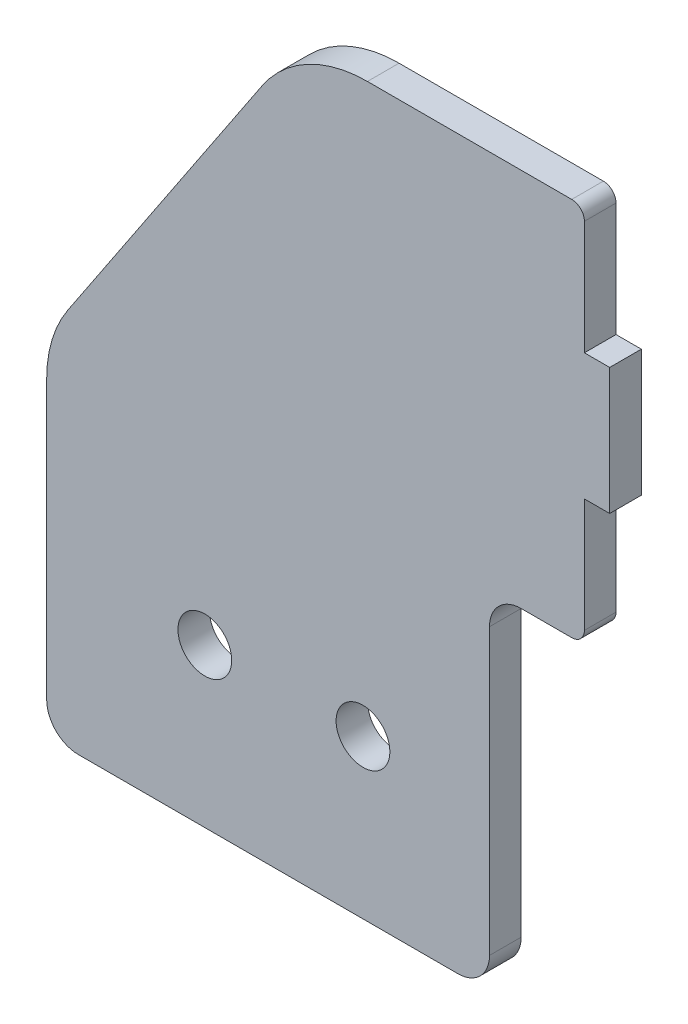
ISO-10303-21;
HEADER;
FILE_DESCRIPTION(('STEP AP214'),'2;1');
FILE_NAME('part.step','',(''),(''),'','','');
FILE_SCHEMA(('AUTOMOTIVE_DESIGN { 1 0 10303 214 1 1 1 1 }'));
ENDSEC;
DATA;
#1=APPLICATION_CONTEXT('core data for automotive mechanical design processes');
#2=APPLICATION_PROTOCOL_DEFINITION('international standard','automotive_design',2000,#1);
#3=PRODUCT_CONTEXT('',#1,'mechanical');
#4=PRODUCT('Part','Part','',(#3));
#5=PRODUCT_RELATED_PRODUCT_CATEGORY('part','',(#4));
#6=PRODUCT_DEFINITION_FORMATION('','',#4);
#7=PRODUCT_DEFINITION_CONTEXT('part definition',#1,'design');
#8=PRODUCT_DEFINITION('design','',#6,#7);
#9=PRODUCT_DEFINITION_SHAPE('','',#8);
#10=(LENGTH_UNIT() NAMED_UNIT(*) SI_UNIT(.MILLI.,.METRE.));
#11=(NAMED_UNIT(*) PLANE_ANGLE_UNIT() SI_UNIT($,.RADIAN.));
#12=(NAMED_UNIT(*) SI_UNIT($,.STERADIAN.) SOLID_ANGLE_UNIT());
#13=UNCERTAINTY_MEASURE_WITH_UNIT(LENGTH_MEASURE(1.E-05),#10,'distance_accuracy_value','');
#14=(GEOMETRIC_REPRESENTATION_CONTEXT(3) GLOBAL_UNCERTAINTY_ASSIGNED_CONTEXT((#13)) GLOBAL_UNIT_ASSIGNED_CONTEXT((#10,
#11,#12)) REPRESENTATION_CONTEXT('',''));
#15=CARTESIAN_POINT('',(0.,0.,0.));
#16=DIRECTION('',(0.,0.,1.));
#17=DIRECTION('',(1.,0.,0.));
#18=AXIS2_PLACEMENT_3D('',#15,#16,#17);
#19=CARTESIAN_POINT('',(0.,0.,-5.));
#20=DIRECTION('',(1.,0.,0.));
#21=DIRECTION('',(0.,1.,0.));
#22=AXIS2_PLACEMENT_3D('',#19,#20,#21);
#23=PLANE('',#22);
#24=DIRECTION('',(0.,1.,0.));
#25=VECTOR('',#24,1.);
#26=CARTESIAN_POINT('',(0.,0.,-5.));
#27=LINE('',#26,#25);
#28=CARTESIAN_POINT('',(0.,-58.,-5.));
#29=VERTEX_POINT('',#28);
#30=CARTESIAN_POINT('',(0.,-40.,-5.));
#31=VERTEX_POINT('',#30);
#32=EDGE_CURVE('E204',#29,#31,#27,.T.);
#33=ORIENTED_EDGE('',*,*,#32,.T.);
#34=DIRECTION('',(0.,0.,-1.));
#35=VECTOR('',#34,1.);
#36=CARTESIAN_POINT('',(0.,-40.,0.));
#37=LINE('',#36,#35);
#38=CARTESIAN_POINT('',(0.,-40.,0.));
#39=VERTEX_POINT('',#38);
#40=EDGE_CURVE('E317',#39,#31,#37,.T.);
#41=ORIENTED_EDGE('',*,*,#40,.F.);
#42=DIRECTION('',(0.,1.,0.));
#43=VECTOR('',#42,1.);
#44=CARTESIAN_POINT('',(0.,0.,0.));
#45=LINE('',#44,#43);
#46=CARTESIAN_POINT('',(0.,-58.,0.));
#47=VERTEX_POINT('',#46);
#48=EDGE_CURVE('E185',#47,#39,#45,.T.);
#49=ORIENTED_EDGE('',*,*,#48,.F.);
#50=DIRECTION('',(0.,0.,1.));
#51=VECTOR('',#50,1.);
#52=CARTESIAN_POINT('',(0.,-58.,-5.));
#53=LINE('',#52,#51);
#54=EDGE_CURVE('E298',#47,#29,#53,.F.);
#55=ORIENTED_EDGE('',*,*,#54,.T.);
#56=EDGE_LOOP('',(#33,#41,#49,#55));
#57=FACE_BOUND('',#56,.T.);
#58=ADVANCED_FACE('F39',(#57),#23,.T.);
#59=CARTESIAN_POINT('',(0.,-20.,0.));
#60=VERTEX_POINT('',#59);
#61=CARTESIAN_POINT('',(0.,-2.,0.));
#62=VERTEX_POINT('',#61);
#63=EDGE_CURVE('E203',#60,#62,#45,.T.);
#64=ORIENTED_EDGE('',*,*,#63,.F.);
#65=DIRECTION('',(0.,0.,1.));
#66=VECTOR('',#65,1.);
#67=CARTESIAN_POINT('',(0.,-20.,0.));
#68=LINE('',#67,#66);
#69=CARTESIAN_POINT('',(0.,-20.,-5.));
#70=VERTEX_POINT('',#69);
#71=EDGE_CURVE('E179',#70,#60,#68,.T.);
#72=ORIENTED_EDGE('',*,*,#71,.F.);
#73=CARTESIAN_POINT('',(0.,-2.,-5.));
#74=VERTEX_POINT('',#73);
#75=EDGE_CURVE('E208',#70,#74,#27,.T.);
#76=ORIENTED_EDGE('',*,*,#75,.T.);
#77=DIRECTION('',(0.,0.,1.));
#78=VECTOR('',#77,1.);
#79=CARTESIAN_POINT('',(0.,-2.,-5.));
#80=LINE('',#79,#78);
#81=EDGE_CURVE('E295',#74,#62,#80,.T.);
#82=ORIENTED_EDGE('',*,*,#81,.T.);
#83=EDGE_LOOP('',(#64,#72,#76,#82));
#84=FACE_BOUND('',#83,.T.);
#85=ADVANCED_FACE('F330',(#84),#23,.T.);
#86=CARTESIAN_POINT('',(0.,-60.,-5.));
#87=DIRECTION('',(0.,-1.,0.));
#88=DIRECTION('',(1.,0.,0.));
#89=AXIS2_PLACEMENT_3D('',#86,#87,#88);
#90=PLANE('',#89);
#91=DIRECTION('',(1.,0.,0.));
#92=VECTOR('',#91,1.);
#93=CARTESIAN_POINT('',(0.,-60.,-5.));
#94=LINE('',#93,#92);
#95=CARTESIAN_POINT('',(-10.,-60.,-5.));
#96=VERTEX_POINT('',#95);
#97=CARTESIAN_POINT('',(-1.99999999999999,-60.,-5.));
#98=VERTEX_POINT('',#97);
#99=EDGE_CURVE('E222',#96,#98,#94,.T.);
#100=ORIENTED_EDGE('',*,*,#99,.T.);
#101=DIRECTION('',(0.,0.,1.));
#102=VECTOR('',#101,1.);
#103=CARTESIAN_POINT('',(-1.99999999999999,-60.,-5.));
#104=LINE('',#103,#102);
#105=CARTESIAN_POINT('',(-1.99999999999999,-60.,0.));
#106=VERTEX_POINT('',#105);
#107=EDGE_CURVE('E288',#98,#106,#104,.T.);
#108=ORIENTED_EDGE('',*,*,#107,.T.);
#109=DIRECTION('',(1.,0.,0.));
#110=VECTOR('',#109,1.);
#111=CARTESIAN_POINT('',(0.,-60.,0.));
#112=LINE('',#111,#110);
#113=CARTESIAN_POINT('',(-10.,-60.,0.));
#114=VERTEX_POINT('',#113);
#115=EDGE_CURVE('E241',#114,#106,#112,.T.);
#116=ORIENTED_EDGE('',*,*,#115,.F.);
#117=DIRECTION('',(0.,0.,1.));
#118=VECTOR('',#117,1.);
#119=CARTESIAN_POINT('',(-10.,-60.,-5.));
#120=LINE('',#119,#118);
#121=EDGE_CURVE('E282',#114,#96,#120,.F.);
#122=ORIENTED_EDGE('',*,*,#121,.T.);
#123=EDGE_LOOP('',(#100,#108,#116,#122));
#124=FACE_BOUND('',#123,.T.);
#125=ADVANCED_FACE('F312',(#124),#90,.T.);
#126=CARTESIAN_POINT('',(-15.,-60.,-5.));
#127=DIRECTION('',(1.,0.,0.));
#128=DIRECTION('',(0.,1.,0.));
#129=AXIS2_PLACEMENT_3D('',#126,#127,#128);
#130=PLANE('',#129);
#131=DIRECTION('',(0.,1.,0.));
#132=VECTOR('',#131,1.);
#133=CARTESIAN_POINT('',(-15.,-60.,0.));
#134=LINE('',#133,#132);
#135=CARTESIAN_POINT('',(-15.,-110.,0.));
#136=VERTEX_POINT('',#135);
#137=CARTESIAN_POINT('',(-15.,-65.,0.));
#138=VERTEX_POINT('',#137);
#139=EDGE_CURVE('E238',#136,#138,#134,.T.);
#140=ORIENTED_EDGE('',*,*,#139,.F.);
#141=DIRECTION('',(0.,0.,1.));
#142=VECTOR('',#141,1.);
#143=CARTESIAN_POINT('',(-15.,-110.,-5.));
#144=LINE('',#143,#142);
#145=CARTESIAN_POINT('',(-15.,-110.,-5.));
#146=VERTEX_POINT('',#145);
#147=EDGE_CURVE('E280',#136,#146,#144,.F.);
#148=ORIENTED_EDGE('',*,*,#147,.T.);
#149=DIRECTION('',(0.,1.,0.));
#150=VECTOR('',#149,1.);
#151=CARTESIAN_POINT('',(-15.,-60.,-5.));
#152=LINE('',#151,#150);
#153=CARTESIAN_POINT('',(-15.,-65.,-5.));
#154=VERTEX_POINT('',#153);
#155=EDGE_CURVE('E219',#146,#154,#152,.T.);
#156=ORIENTED_EDGE('',*,*,#155,.T.);
#157=DIRECTION('',(0.,0.,1.));
#158=VECTOR('',#157,1.);
#159=CARTESIAN_POINT('',(-15.,-65.,0.));
#160=LINE('',#159,#158);
#161=EDGE_CURVE('E277',#154,#138,#160,.T.);
#162=ORIENTED_EDGE('',*,*,#161,.T.);
#163=EDGE_LOOP('',(#140,#148,#156,#162));
#164=FACE_BOUND('',#163,.T.);
#165=ADVANCED_FACE('F371',(#164),#130,.T.);
#166=CARTESIAN_POINT('',(-15.,-115.,-5.));
#167=DIRECTION('',(0.,-1.,0.));
#168=DIRECTION('',(0.,0.,-1.));
#169=AXIS2_PLACEMENT_3D('',#166,#167,#168);
#170=PLANE('',#169);
#171=DIRECTION('',(1.,0.,0.));
#172=VECTOR('',#171,1.);
#173=CARTESIAN_POINT('',(-15.,-115.,0.));
#174=LINE('',#173,#172);
#175=CARTESIAN_POINT('',(-80.,-115.,0.));
#176=VERTEX_POINT('',#175);
#177=CARTESIAN_POINT('',(-20.,-115.,0.));
#178=VERTEX_POINT('',#177);
#179=EDGE_CURVE('E235',#176,#178,#174,.T.);
#180=ORIENTED_EDGE('',*,*,#179,.F.);
#181=DIRECTION('',(0.,0.,1.));
#182=VECTOR('',#181,1.);
#183=CARTESIAN_POINT('',(-80.,-115.,-5.));
#184=LINE('',#183,#182);
#185=CARTESIAN_POINT('',(-80.,-115.,-5.));
#186=VERTEX_POINT('',#185);
#187=EDGE_CURVE('E271',#176,#186,#184,.F.);
#188=ORIENTED_EDGE('',*,*,#187,.T.);
#189=DIRECTION('',(1.,0.,0.));
#190=VECTOR('',#189,1.);
#191=CARTESIAN_POINT('',(-15.,-115.,-5.));
#192=LINE('',#191,#190);
#193=CARTESIAN_POINT('',(-20.,-115.,-5.));
#194=VERTEX_POINT('',#193);
#195=EDGE_CURVE('E216',#186,#194,#192,.T.);
#196=ORIENTED_EDGE('',*,*,#195,.T.);
#197=DIRECTION('',(0.,0.,1.));
#198=VECTOR('',#197,1.);
#199=CARTESIAN_POINT('',(-20.,-115.,-5.));
#200=LINE('',#199,#198);
#201=EDGE_CURVE('E268',#194,#178,#200,.T.);
#202=ORIENTED_EDGE('',*,*,#201,.T.);
#203=EDGE_LOOP('',(#180,#188,#196,#202));
#204=FACE_BOUND('',#203,.T.);
#205=ADVANCED_FACE('F362',(#204),#170,.T.);
#206=CARTESIAN_POINT('',(-85.,-115.,-5.));
#207=DIRECTION('',(-1.,0.,0.));
#208=DIRECTION('',(0.,0.,1.));
#209=AXIS2_PLACEMENT_3D('',#206,#207,#208);
#210=PLANE('',#209);
#211=DIRECTION('',(0.,-1.,0.));
#212=VECTOR('',#211,1.);
#213=CARTESIAN_POINT('',(-85.,-115.,-5.));
#214=LINE('',#213,#212);
#215=CARTESIAN_POINT('',(-85.,-66.0555127546399,-5.));
#216=VERTEX_POINT('',#215);
#217=CARTESIAN_POINT('',(-85.,-110.,-5.));
#218=VERTEX_POINT('',#217);
#219=EDGE_CURVE('E213',#216,#218,#214,.T.);
#220=ORIENTED_EDGE('',*,*,#219,.T.);
#221=DIRECTION('',(0.,0.,1.));
#222=VECTOR('',#221,1.);
#223=CARTESIAN_POINT('',(-85.,-110.,-5.));
#224=LINE('',#223,#222);
#225=CARTESIAN_POINT('',(-85.,-110.,0.));
#226=VERTEX_POINT('',#225);
#227=EDGE_CURVE('E261',#218,#226,#224,.T.);
#228=ORIENTED_EDGE('',*,*,#227,.T.);
#229=DIRECTION('',(0.,-1.,0.));
#230=VECTOR('',#229,1.);
#231=CARTESIAN_POINT('',(-85.,-115.,0.));
#232=LINE('',#231,#230);
#233=CARTESIAN_POINT('',(-85.,-66.0555127546399,0.));
#234=VERTEX_POINT('',#233);
#235=EDGE_CURVE('E232',#234,#226,#232,.T.);
#236=ORIENTED_EDGE('',*,*,#235,.F.);
#237=DIRECTION('',(0.,0.,1.));
#238=VECTOR('',#237,1.);
#239=CARTESIAN_POINT('',(-85.,-66.0555127546399,-5.));
#240=LINE('',#239,#238);
#241=EDGE_CURVE('E251',#234,#216,#240,.F.);
#242=ORIENTED_EDGE('',*,*,#241,.T.);
#243=EDGE_LOOP('',(#220,#228,#236,#242));
#244=FACE_BOUND('',#243,.T.);
#245=ADVANCED_FACE('F353',(#244),#210,.T.);
#246=CARTESIAN_POINT('',(-85.,-60.,-5.));
#247=DIRECTION('',(-0.832050294337844,0.554700196225229,0.));
#248=DIRECTION('',(-0.554700196225229,-0.832050294337844,0.));
#249=AXIS2_PLACEMENT_3D('',#246,#247,#248);
#250=PLANE('',#249);
#251=DIRECTION('',(-0.554700196225229,-0.832050294337844,0.));
#252=VECTOR('',#251,1.);
#253=CARTESIAN_POINT('',(-85.,-60.,-5.));
#254=LINE('',#253,#252);
#255=CARTESIAN_POINT('',(-50.9373307169969,-8.90599607549541,-5.));
#256=VERTEX_POINT('',#255);
#257=CARTESIAN_POINT('',(-81.6410058867569,-54.9615088301353,-5.));
#258=VERTEX_POINT('',#257);
#259=EDGE_CURVE('E210',#256,#258,#254,.T.);
#260=ORIENTED_EDGE('',*,*,#259,.T.);
#261=DIRECTION('',(0.,0.,1.));
#262=VECTOR('',#261,1.);
#263=CARTESIAN_POINT('',(-81.6410058867569,-54.9615088301353,-5.));
#264=LINE('',#263,#262);
#265=CARTESIAN_POINT('',(-81.6410058867569,-54.9615088301353,0.));
#266=VERTEX_POINT('',#265);
#267=EDGE_CURVE('E244',#258,#266,#264,.T.);
#268=ORIENTED_EDGE('',*,*,#267,.T.);
#269=DIRECTION('',(-0.554700196225229,-0.832050294337844,0.));
#270=VECTOR('',#269,1.);
#271=CARTESIAN_POINT('',(-85.,-60.,0.));
#272=LINE('',#271,#270);
#273=CARTESIAN_POINT('',(-50.9373307169969,-8.90599607549541,0.));
#274=VERTEX_POINT('',#273);
#275=EDGE_CURVE('E229',#274,#266,#272,.T.);
#276=ORIENTED_EDGE('',*,*,#275,.F.);
#277=DIRECTION('',(0.,0.,1.));
#278=VECTOR('',#277,1.);
#279=CARTESIAN_POINT('',(-50.9373307169969,-8.90599607549542,-5.));
#280=LINE('',#279,#278);
#281=EDGE_CURVE('E225',#274,#256,#280,.F.);
#282=ORIENTED_EDGE('',*,*,#281,.T.);
#283=EDGE_LOOP('',(#260,#268,#276,#282));
#284=FACE_BOUND('',#283,.T.);
#285=ADVANCED_FACE('F344',(#284),#250,.T.);
#286=CARTESIAN_POINT('',(0.,0.,-5.));
#287=DIRECTION('',(0.,1.,0.));
#288=DIRECTION('',(-1.,0.,0.));
#289=AXIS2_PLACEMENT_3D('',#286,#287,#288);
#290=PLANE('',#289);
#291=DIRECTION('',(-1.,0.,0.));
#292=VECTOR('',#291,1.);
#293=CARTESIAN_POINT('',(0.,0.,0.));
#294=LINE('',#293,#292);
#295=CARTESIAN_POINT('',(-2.,0.,0.));
#296=VERTEX_POINT('',#295);
#297=CARTESIAN_POINT('',(-34.2963248302401,0.,0.));
#298=VERTEX_POINT('',#297);
#299=EDGE_CURVE('E227',#296,#298,#294,.T.);
#300=ORIENTED_EDGE('',*,*,#299,.F.);
#301=DIRECTION('',(0.,0.,1.));
#302=VECTOR('',#301,1.);
#303=CARTESIAN_POINT('',(-2.,0.,-5.));
#304=LINE('',#303,#302);
#305=CARTESIAN_POINT('',(-2.,0.,-5.));
#306=VERTEX_POINT('',#305);
#307=EDGE_CURVE('E11',#296,#306,#304,.F.);
#308=ORIENTED_EDGE('',*,*,#307,.T.);
#309=DIRECTION('',(-1.,0.,0.));
#310=VECTOR('',#309,1.);
#311=CARTESIAN_POINT('',(0.,0.,-5.));
#312=LINE('',#311,#310);
#313=CARTESIAN_POINT('',(-34.2963248302401,0.,-5.));
#314=VERTEX_POINT('',#313);
#315=EDGE_CURVE('E207',#306,#314,#312,.T.);
#316=ORIENTED_EDGE('',*,*,#315,.T.);
#317=DIRECTION('',(0.,0.,1.));
#318=VECTOR('',#317,1.);
#319=CARTESIAN_POINT('',(-34.2963248302401,0.,-5.));
#320=LINE('',#319,#318);
#321=EDGE_CURVE('E258',#314,#298,#320,.T.);
#322=ORIENTED_EDGE('',*,*,#321,.T.);
#323=EDGE_LOOP('',(#300,#308,#316,#322));
#324=FACE_BOUND('',#323,.T.);
#325=ADVANCED_FACE('F336',(#324),#290,.T.);
#326=CARTESIAN_POINT('',(0.,0.,-5.));
#327=DIRECTION('',(0.,0.,-1.));
#328=DIRECTION('',(-1.,0.,0.));
#329=AXIS2_PLACEMENT_3D('',#326,#327,#328);
#330=PLANE('',#329);
#331=CARTESIAN_POINT('',(-35.,-90.,-5.));
#332=DIRECTION('',(0.,0.,-1.));
#333=DIRECTION('',(-1.,0.,0.));
#334=AXIS2_PLACEMENT_3D('',#331,#332,#333);
#335=CIRCLE('',#334,4.25000000000001);
#336=CARTESIAN_POINT('',(-39.25,-90.,-5.));
#337=VERTEX_POINT('',#336);
#338=EDGE_CURVE('E200',#337,#337,#335,.T.);
#339=ORIENTED_EDGE('',*,*,#338,.F.);
#340=EDGE_LOOP('',(#339));
#341=FACE_BOUND('',#340,.T.);
#342=CARTESIAN_POINT('',(-60.,-90.,-5.));
#343=DIRECTION('',(0.,0.,-1.));
#344=DIRECTION('',(-1.,0.,0.));
#345=AXIS2_PLACEMENT_3D('',#342,#343,#344);
#346=CIRCLE('',#345,4.25000000000001);
#347=CARTESIAN_POINT('',(-64.25,-90.,-5.));
#348=VERTEX_POINT('',#347);
#349=EDGE_CURVE('E196',#348,#348,#346,.T.);
#350=ORIENTED_EDGE('',*,*,#349,.F.);
#351=EDGE_LOOP('',(#350));
#352=FACE_BOUND('',#351,.T.);
#353=ORIENTED_EDGE('',*,*,#32,.F.);
#354=CARTESIAN_POINT('',(-1.99999999999999,-58.,-5.));
#355=DIRECTION('',(0.,0.,-1.));
#356=DIRECTION('',(-1.,0.,0.));
#357=AXIS2_PLACEMENT_3D('',#354,#355,#356);
#358=CIRCLE('',#357,2.);
#359=EDGE_CURVE('E47',#29,#98,#358,.T.);
#360=ORIENTED_EDGE('',*,*,#359,.T.);
#361=ORIENTED_EDGE('',*,*,#99,.F.);
#362=CARTESIAN_POINT('',(-9.99999999999999,-65.,-5.));
#363=DIRECTION('',(0.,0.,-1.));
#364=DIRECTION('',(-1.,0.,0.));
#365=AXIS2_PLACEMENT_3D('',#362,#363,#364);
#366=CIRCLE('',#365,5.);
#367=EDGE_CURVE('E286',#96,#154,#366,.F.);
#368=ORIENTED_EDGE('',*,*,#367,.T.);
#369=ORIENTED_EDGE('',*,*,#155,.F.);
#370=CARTESIAN_POINT('',(-20.,-110.,-5.));
#371=DIRECTION('',(0.,0.,-1.));
#372=DIRECTION('',(-1.,0.,0.));
#373=AXIS2_PLACEMENT_3D('',#370,#371,#372);
#374=CIRCLE('',#373,5.);
#375=EDGE_CURVE('E273',#146,#194,#374,.T.);
#376=ORIENTED_EDGE('',*,*,#375,.T.);
#377=ORIENTED_EDGE('',*,*,#195,.F.);
#378=CARTESIAN_POINT('',(-80.,-110.,-5.));
#379=DIRECTION('',(0.,0.,-1.));
#380=DIRECTION('',(-1.,0.,0.));
#381=AXIS2_PLACEMENT_3D('',#378,#379,#380);
#382=CIRCLE('',#381,5.);
#383=EDGE_CURVE('E275',#186,#218,#382,.T.);
#384=ORIENTED_EDGE('',*,*,#383,.T.);
#385=ORIENTED_EDGE('',*,*,#219,.F.);
#386=CARTESIAN_POINT('',(-65.,-66.0555127546399,-5.));
#387=DIRECTION('',(0.,0.,-1.));
#388=DIRECTION('',(-1.,0.,0.));
#389=AXIS2_PLACEMENT_3D('',#386,#387,#388);
#390=CIRCLE('',#389,20.);
#391=EDGE_CURVE('E256',#216,#258,#390,.T.);
#392=ORIENTED_EDGE('',*,*,#391,.T.);
#393=ORIENTED_EDGE('',*,*,#259,.F.);
#394=CARTESIAN_POINT('',(-34.2963248302401,-20.,-5.));
#395=DIRECTION('',(0.,0.,-1.));
#396=DIRECTION('',(-1.,0.,0.));
#397=AXIS2_PLACEMENT_3D('',#394,#395,#396);
#398=CIRCLE('',#397,20.);
#399=EDGE_CURVE('E253',#256,#314,#398,.T.);
#400=ORIENTED_EDGE('',*,*,#399,.T.);
#401=ORIENTED_EDGE('',*,*,#315,.F.);
#402=CARTESIAN_POINT('',(-2.,-2.,-5.));
#403=DIRECTION('',(0.,0.,-1.));
#404=DIRECTION('',(-1.,0.,0.));
#405=AXIS2_PLACEMENT_3D('',#402,#403,#404);
#406=CIRCLE('',#405,2.);
#407=EDGE_CURVE('E300',#306,#74,#406,.T.);
#408=ORIENTED_EDGE('',*,*,#407,.T.);
#409=ORIENTED_EDGE('',*,*,#75,.F.);
#410=DIRECTION('',(-1.,0.,0.));
#411=VECTOR('',#410,1.);
#412=CARTESIAN_POINT('',(4.,-20.,-5.));
#413=LINE('',#412,#411);
#414=CARTESIAN_POINT('',(4.,-20.,-5.));
#415=VERTEX_POINT('',#414);
#416=EDGE_CURVE('E191',#415,#70,#413,.T.);
#417=ORIENTED_EDGE('',*,*,#416,.F.);
#418=DIRECTION('',(0.,1.,0.));
#419=VECTOR('',#418,1.);
#420=CARTESIAN_POINT('',(4.,-20.,-5.));
#421=LINE('',#420,#419);
#422=CARTESIAN_POINT('',(4.00000000000001,-40.,-5.));
#423=VERTEX_POINT('',#422);
#424=EDGE_CURVE('E173',#423,#415,#421,.T.);
#425=ORIENTED_EDGE('',*,*,#424,.F.);
#426=DIRECTION('',(-1.,0.,0.));
#427=VECTOR('',#426,1.);
#428=CARTESIAN_POINT('',(4.00000000000001,-40.,-5.));
#429=LINE('',#428,#427);
#430=EDGE_CURVE('E170',#423,#31,#429,.T.);
#431=ORIENTED_EDGE('',*,*,#430,.T.);
#432=EDGE_LOOP('',(#353,#360,#361,#368,#369,#376,#377,#384,#385,#392,#393,#400,#401,#408,#409,
#417,#425,#431));
#433=FACE_BOUND('',#432,.T.);
#434=ADVANCED_FACE('F306',(#341,#352,#433),#330,.T.);
#435=CARTESIAN_POINT('',(0.,0.,0.));
#436=DIRECTION('',(0.,0.,-1.));
#437=DIRECTION('',(-1.,0.,0.));
#438=AXIS2_PLACEMENT_3D('',#435,#436,#437);
#439=PLANE('',#438);
#440=CARTESIAN_POINT('',(-35.,-90.,0.));
#441=DIRECTION('',(0.,0.,1.));
#442=DIRECTION('',(1.,0.,0.));
#443=AXIS2_PLACEMENT_3D('',#440,#441,#442);
#444=CIRCLE('',#443,4.25000000000001);
#445=CARTESIAN_POINT('',(-30.75,-90.,0.));
#446=VERTEX_POINT('',#445);
#447=EDGE_CURVE('E189',#446,#446,#444,.T.);
#448=ORIENTED_EDGE('',*,*,#447,.F.);
#449=EDGE_LOOP('',(#448));
#450=FACE_BOUND('',#449,.T.);
#451=CARTESIAN_POINT('',(-60.,-90.,0.));
#452=DIRECTION('',(0.,0.,1.));
#453=DIRECTION('',(1.,0.,0.));
#454=AXIS2_PLACEMENT_3D('',#451,#452,#453);
#455=CIRCLE('',#454,4.25000000000001);
#456=CARTESIAN_POINT('',(-55.75,-90.,0.));
#457=VERTEX_POINT('',#456);
#458=EDGE_CURVE('E186',#457,#457,#455,.T.);
#459=ORIENTED_EDGE('',*,*,#458,.F.);
#460=EDGE_LOOP('',(#459));
#461=FACE_BOUND('',#460,.T.);
#462=ORIENTED_EDGE('',*,*,#115,.T.);
#463=CARTESIAN_POINT('',(-1.99999999999999,-58.,0.));
#464=DIRECTION('',(0.,0.,-1.));
#465=DIRECTION('',(-1.,0.,0.));
#466=AXIS2_PLACEMENT_3D('',#463,#464,#465);
#467=CIRCLE('',#466,2.);
#468=EDGE_CURVE('E293',#106,#47,#467,.F.);
#469=ORIENTED_EDGE('',*,*,#468,.T.);
#470=ORIENTED_EDGE('',*,*,#48,.T.);
#471=DIRECTION('',(-1.,0.,0.));
#472=VECTOR('',#471,1.);
#473=CARTESIAN_POINT('',(4.00000000000001,-40.,0.));
#474=LINE('',#473,#472);
#475=CARTESIAN_POINT('',(4.00000000000001,-40.,0.));
#476=VERTEX_POINT('',#475);
#477=EDGE_CURVE('E167',#476,#39,#474,.T.);
#478=ORIENTED_EDGE('',*,*,#477,.F.);
#479=DIRECTION('',(0.,-1.,0.));
#480=VECTOR('',#479,1.);
#481=CARTESIAN_POINT('',(4.,-20.,0.));
#482=LINE('',#481,#480);
#483=CARTESIAN_POINT('',(4.,-20.,0.));
#484=VERTEX_POINT('',#483);
#485=EDGE_CURVE('E174',#484,#476,#482,.T.);
#486=ORIENTED_EDGE('',*,*,#485,.F.);
#487=DIRECTION('',(-1.,0.,0.));
#488=VECTOR('',#487,1.);
#489=CARTESIAN_POINT('',(4.,-20.,0.));
#490=LINE('',#489,#488);
#491=EDGE_CURVE('E54',#484,#60,#490,.T.);
#492=ORIENTED_EDGE('',*,*,#491,.T.);
#493=ORIENTED_EDGE('',*,*,#63,.T.);
#494=CARTESIAN_POINT('',(-2.,-2.,0.));
#495=DIRECTION('',(0.,0.,-1.));
#496=DIRECTION('',(-1.,0.,0.));
#497=AXIS2_PLACEMENT_3D('',#494,#495,#496);
#498=CIRCLE('',#497,2.);
#499=EDGE_CURVE('E291',#62,#296,#498,.F.);
#500=ORIENTED_EDGE('',*,*,#499,.T.);
#501=ORIENTED_EDGE('',*,*,#299,.T.);
#502=CARTESIAN_POINT('',(-34.2963248302401,-20.,0.));
#503=DIRECTION('',(0.,0.,-1.));
#504=DIRECTION('',(-1.,0.,0.));
#505=AXIS2_PLACEMENT_3D('',#502,#503,#504);
#506=CIRCLE('',#505,20.);
#507=EDGE_CURVE('E247',#298,#274,#506,.F.);
#508=ORIENTED_EDGE('',*,*,#507,.T.);
#509=ORIENTED_EDGE('',*,*,#275,.T.);
#510=CARTESIAN_POINT('',(-65.,-66.0555127546399,0.));
#511=DIRECTION('',(0.,0.,-1.));
#512=DIRECTION('',(-1.,0.,0.));
#513=AXIS2_PLACEMENT_3D('',#510,#511,#512);
#514=CIRCLE('',#513,20.);
#515=EDGE_CURVE('E249',#266,#234,#514,.F.);
#516=ORIENTED_EDGE('',*,*,#515,.T.);
#517=ORIENTED_EDGE('',*,*,#235,.T.);
#518=CARTESIAN_POINT('',(-80.,-110.,0.));
#519=DIRECTION('',(0.,0.,-1.));
#520=DIRECTION('',(-1.,0.,0.));
#521=AXIS2_PLACEMENT_3D('',#518,#519,#520);
#522=CIRCLE('',#521,5.);
#523=EDGE_CURVE('E266',#226,#176,#522,.F.);
#524=ORIENTED_EDGE('',*,*,#523,.T.);
#525=ORIENTED_EDGE('',*,*,#179,.T.);
#526=CARTESIAN_POINT('',(-20.,-110.,0.));
#527=DIRECTION('',(0.,0.,-1.));
#528=DIRECTION('',(-1.,0.,0.));
#529=AXIS2_PLACEMENT_3D('',#526,#527,#528);
#530=CIRCLE('',#529,5.);
#531=EDGE_CURVE('E264',#178,#136,#530,.F.);
#532=ORIENTED_EDGE('',*,*,#531,.T.);
#533=ORIENTED_EDGE('',*,*,#139,.T.);
#534=CARTESIAN_POINT('',(-9.99999999999999,-65.,0.));
#535=DIRECTION('',(0.,0.,-1.));
#536=DIRECTION('',(-1.,0.,0.));
#537=AXIS2_PLACEMENT_3D('',#534,#535,#536);
#538=CIRCLE('',#537,5.);
#539=EDGE_CURVE('E284',#138,#114,#538,.T.);
#540=ORIENTED_EDGE('',*,*,#539,.T.);
#541=EDGE_LOOP('',(#462,#469,#470,#478,#486,#492,#493,#500,#501,#508,#509,#516,#517,#524,#525,
#532,#533,#540));
#542=FACE_BOUND('',#541,.T.);
#543=ADVANCED_FACE('F183',(#450,#461,#542),#439,.F.);
#544=CARTESIAN_POINT('',(-60.,-90.,-10.));
#545=DIRECTION('',(0.,0.,1.));
#546=DIRECTION('',(1.,0.,0.));
#547=AXIS2_PLACEMENT_3D('',#544,#545,#546);
#548=CYLINDRICAL_SURFACE('',#547,4.25000000000001);
#549=ORIENTED_EDGE('',*,*,#349,.T.);
#550=EDGE_LOOP('',(#549));
#551=FACE_BOUND('',#550,.T.);
#552=ORIENTED_EDGE('',*,*,#458,.T.);
#553=EDGE_LOOP('',(#552));
#554=FACE_BOUND('',#553,.T.);
#555=ADVANCED_FACE('F475',(#551,#554),#548,.F.);
#556=CARTESIAN_POINT('',(-35.,-90.,-10.));
#557=DIRECTION('',(0.,0.,1.));
#558=DIRECTION('',(1.,0.,0.));
#559=AXIS2_PLACEMENT_3D('',#556,#557,#558);
#560=CYLINDRICAL_SURFACE('',#559,4.25000000000001);
#561=ORIENTED_EDGE('',*,*,#338,.T.);
#562=EDGE_LOOP('',(#561));
#563=FACE_BOUND('',#562,.T.);
#564=ORIENTED_EDGE('',*,*,#447,.T.);
#565=EDGE_LOOP('',(#564));
#566=FACE_BOUND('',#565,.T.);
#567=ADVANCED_FACE('F393',(#563,#566),#560,.F.);
#568=CARTESIAN_POINT('',(-65.,-66.0555127546399,-5.));
#569=DIRECTION('',(0.,0.,1.));
#570=DIRECTION('',(1.,0.,0.));
#571=AXIS2_PLACEMENT_3D('',#568,#569,#570);
#572=CYLINDRICAL_SURFACE('',#571,20.);
#573=ORIENTED_EDGE('',*,*,#391,.F.);
#574=ORIENTED_EDGE('',*,*,#241,.F.);
#575=ORIENTED_EDGE('',*,*,#515,.F.);
#576=ORIENTED_EDGE('',*,*,#267,.F.);
#577=EDGE_LOOP('',(#573,#574,#575,#576));
#578=FACE_BOUND('',#577,.T.);
#579=ADVANCED_FACE('F349',(#578),#572,.T.);
#580=CARTESIAN_POINT('',(-34.2963248302401,-20.,-5.));
#581=DIRECTION('',(0.,0.,1.));
#582=DIRECTION('',(1.,0.,0.));
#583=AXIS2_PLACEMENT_3D('',#580,#581,#582);
#584=CYLINDRICAL_SURFACE('',#583,20.);
#585=ORIENTED_EDGE('',*,*,#399,.F.);
#586=ORIENTED_EDGE('',*,*,#281,.F.);
#587=ORIENTED_EDGE('',*,*,#507,.F.);
#588=ORIENTED_EDGE('',*,*,#321,.F.);
#589=EDGE_LOOP('',(#585,#586,#587,#588));
#590=FACE_BOUND('',#589,.T.);
#591=ADVANCED_FACE('F340',(#590),#584,.T.);
#592=CARTESIAN_POINT('',(-80.,-110.,-5.));
#593=DIRECTION('',(0.,0.,1.));
#594=DIRECTION('',(1.,0.,0.));
#595=AXIS2_PLACEMENT_3D('',#592,#593,#594);
#596=CYLINDRICAL_SURFACE('',#595,5.);
#597=ORIENTED_EDGE('',*,*,#383,.F.);
#598=ORIENTED_EDGE('',*,*,#187,.F.);
#599=ORIENTED_EDGE('',*,*,#523,.F.);
#600=ORIENTED_EDGE('',*,*,#227,.F.);
#601=EDGE_LOOP('',(#597,#598,#599,#600));
#602=FACE_BOUND('',#601,.T.);
#603=ADVANCED_FACE('F358',(#602),#596,.T.);
#604=CARTESIAN_POINT('',(-20.,-110.,-5.));
#605=DIRECTION('',(0.,0.,1.));
#606=DIRECTION('',(1.,0.,0.));
#607=AXIS2_PLACEMENT_3D('',#604,#605,#606);
#608=CYLINDRICAL_SURFACE('',#607,5.);
#609=ORIENTED_EDGE('',*,*,#375,.F.);
#610=ORIENTED_EDGE('',*,*,#147,.F.);
#611=ORIENTED_EDGE('',*,*,#531,.F.);
#612=ORIENTED_EDGE('',*,*,#201,.F.);
#613=EDGE_LOOP('',(#609,#610,#611,#612));
#614=FACE_BOUND('',#613,.T.);
#615=ADVANCED_FACE('F367',(#614),#608,.T.);
#616=CARTESIAN_POINT('',(-9.99999999999999,-65.,-5.));
#617=DIRECTION('',(0.,0.,-1.));
#618=DIRECTION('',(-1.,0.,0.));
#619=AXIS2_PLACEMENT_3D('',#616,#617,#618);
#620=CYLINDRICAL_SURFACE('',#619,5.);
#621=ORIENTED_EDGE('',*,*,#367,.F.);
#622=ORIENTED_EDGE('',*,*,#121,.F.);
#623=ORIENTED_EDGE('',*,*,#539,.F.);
#624=ORIENTED_EDGE('',*,*,#161,.F.);
#625=EDGE_LOOP('',(#621,#622,#623,#624));
#626=FACE_BOUND('',#625,.T.);
#627=ADVANCED_FACE('F375',(#626),#620,.F.);
#628=CARTESIAN_POINT('',(-1.99999999999999,-58.,-5.));
#629=DIRECTION('',(0.,0.,1.));
#630=DIRECTION('',(1.,0.,0.));
#631=AXIS2_PLACEMENT_3D('',#628,#629,#630);
#632=CYLINDRICAL_SURFACE('',#631,2.);
#633=ORIENTED_EDGE('',*,*,#359,.F.);
#634=ORIENTED_EDGE('',*,*,#54,.F.);
#635=ORIENTED_EDGE('',*,*,#468,.F.);
#636=ORIENTED_EDGE('',*,*,#107,.F.);
#637=EDGE_LOOP('',(#633,#634,#635,#636));
#638=FACE_BOUND('',#637,.T.);
#639=ADVANCED_FACE('F315',(#638),#632,.T.);
#640=CARTESIAN_POINT('',(-2.,-2.,-5.));
#641=DIRECTION('',(0.,0.,1.));
#642=DIRECTION('',(1.,0.,0.));
#643=AXIS2_PLACEMENT_3D('',#640,#641,#642);
#644=CYLINDRICAL_SURFACE('',#643,2.);
#645=ORIENTED_EDGE('',*,*,#407,.F.);
#646=ORIENTED_EDGE('',*,*,#307,.F.);
#647=ORIENTED_EDGE('',*,*,#499,.F.);
#648=ORIENTED_EDGE('',*,*,#81,.F.);
#649=EDGE_LOOP('',(#645,#646,#647,#648));
#650=FACE_BOUND('',#649,.T.);
#651=ADVANCED_FACE('F41',(#650),#644,.T.);
#652=CARTESIAN_POINT('',(4.00000000000001,-40.,0.));
#653=DIRECTION('',(0.,1.,0.));
#654=DIRECTION('',(-1.,0.,0.));
#655=AXIS2_PLACEMENT_3D('',#652,#653,#654);
#656=PLANE('',#655);
#657=ORIENTED_EDGE('',*,*,#40,.T.);
#658=ORIENTED_EDGE('',*,*,#430,.F.);
#659=DIRECTION('',(0.,0.,-1.));
#660=VECTOR('',#659,1.);
#661=CARTESIAN_POINT('',(4.00000000000001,-40.,0.));
#662=LINE('',#661,#660);
#663=EDGE_CURVE('E163',#476,#423,#662,.T.);
#664=ORIENTED_EDGE('',*,*,#663,.F.);
#665=ORIENTED_EDGE('',*,*,#477,.T.);
#666=EDGE_LOOP('',(#657,#658,#664,#665));
#667=FACE_BOUND('',#666,.T.);
#668=ADVANCED_FACE('F165',(#667),#656,.F.);
#669=CARTESIAN_POINT('',(4.,-20.,0.));
#670=DIRECTION('',(0.,-1.,0.));
#671=DIRECTION('',(0.,0.,-1.));
#672=AXIS2_PLACEMENT_3D('',#669,#670,#671);
#673=PLANE('',#672);
#674=ORIENTED_EDGE('',*,*,#71,.T.);
#675=ORIENTED_EDGE('',*,*,#491,.F.);
#676=DIRECTION('',(0.,0.,1.));
#677=VECTOR('',#676,1.);
#678=CARTESIAN_POINT('',(4.,-20.,0.));
#679=LINE('',#678,#677);
#680=EDGE_CURVE('E178',#415,#484,#679,.T.);
#681=ORIENTED_EDGE('',*,*,#680,.F.);
#682=ORIENTED_EDGE('',*,*,#416,.T.);
#683=EDGE_LOOP('',(#674,#675,#681,#682));
#684=FACE_BOUND('',#683,.T.);
#685=ADVANCED_FACE('F326',(#684),#673,.F.);
#686=CARTESIAN_POINT('',(4.,0.,0.));
#687=DIRECTION('',(1.,0.,0.));
#688=DIRECTION('',(0.,1.,0.));
#689=AXIS2_PLACEMENT_3D('',#686,#687,#688);
#690=PLANE('',#689);
#691=ORIENTED_EDGE('',*,*,#485,.T.);
#692=ORIENTED_EDGE('',*,*,#663,.T.);
#693=ORIENTED_EDGE('',*,*,#424,.T.);
#694=ORIENTED_EDGE('',*,*,#680,.T.);
#695=EDGE_LOOP('',(#691,#692,#693,#694));
#696=FACE_BOUND('',#695,.T.);
#697=ADVANCED_FACE('F176',(#696),#690,.T.);
#698=CLOSED_SHELL('',(#58,#85,#125,#165,#205,#245,#285,#325,#434,#543,#555,#567,#579,#591,#603,
#615,#627,#639,#651,#668,#685,#697));
#699=MANIFOLD_SOLID_BREP('B2',#698);
#700=ADVANCED_BREP_SHAPE_REPRESENTATION('',(#18,#699),#14);
#701=SHAPE_DEFINITION_REPRESENTATION(#9,#700);
ENDSEC;
END-ISO-10303-21;
